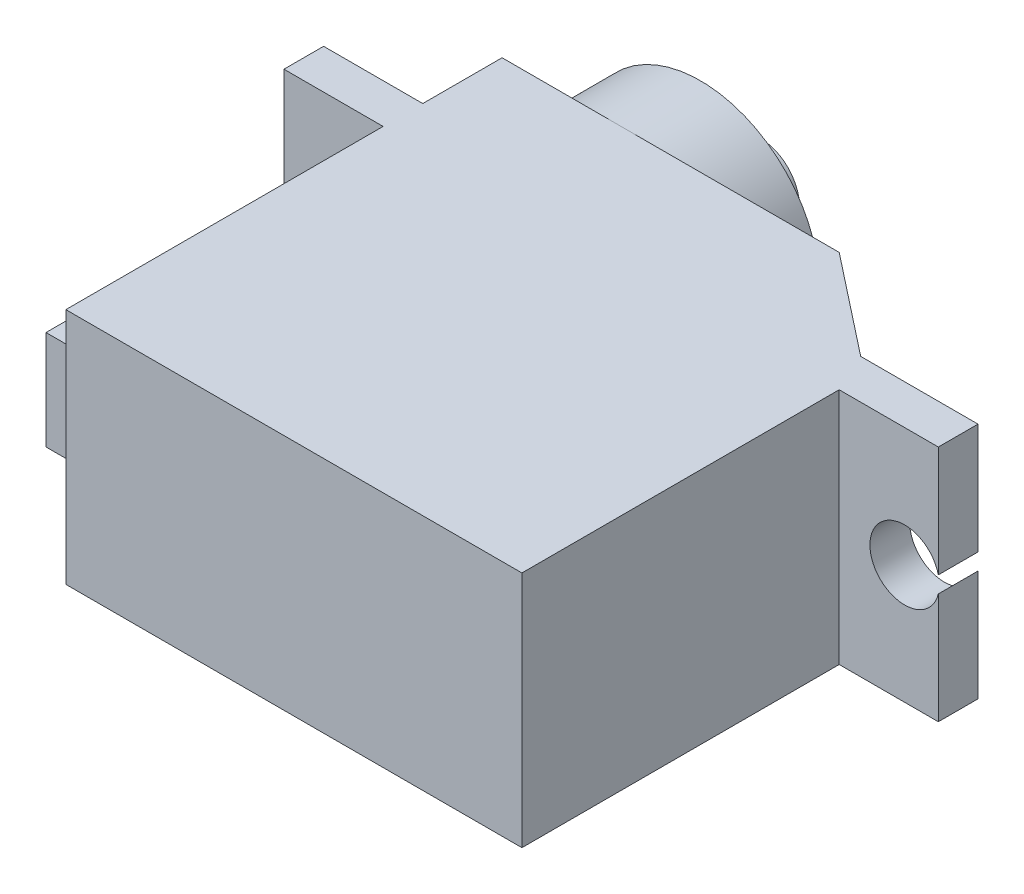
ISO-10303-21;
HEADER;
FILE_DESCRIPTION(('STEP AP214'),'2;1');
FILE_NAME('part.step','',(''),(''),'','','');
FILE_SCHEMA(('AUTOMOTIVE_DESIGN { 1 0 10303 214 1 1 1 1 }'));
ENDSEC;
DATA;
#1=APPLICATION_CONTEXT('core data for automotive mechanical design processes');
#2=APPLICATION_PROTOCOL_DEFINITION('international standard','automotive_design',2000,#1);
#3=PRODUCT_CONTEXT('',#1,'mechanical');
#4=PRODUCT('Part','Part','',(#3));
#5=PRODUCT_RELATED_PRODUCT_CATEGORY('part','',(#4));
#6=PRODUCT_DEFINITION_FORMATION('','',#4);
#7=PRODUCT_DEFINITION_CONTEXT('part definition',#1,'design');
#8=PRODUCT_DEFINITION('design','',#6,#7);
#9=PRODUCT_DEFINITION_SHAPE('','',#8);
#10=(LENGTH_UNIT() NAMED_UNIT(*) SI_UNIT(.MILLI.,.METRE.));
#11=(NAMED_UNIT(*) PLANE_ANGLE_UNIT() SI_UNIT($,.RADIAN.));
#12=(NAMED_UNIT(*) SI_UNIT($,.STERADIAN.) SOLID_ANGLE_UNIT());
#13=UNCERTAINTY_MEASURE_WITH_UNIT(LENGTH_MEASURE(1.E-05),#10,'distance_accuracy_value','');
#14=(GEOMETRIC_REPRESENTATION_CONTEXT(3) GLOBAL_UNCERTAINTY_ASSIGNED_CONTEXT((#13)) GLOBAL_UNIT_ASSIGNED_CONTEXT((#10,
#11,#12)) REPRESENTATION_CONTEXT('',''));
#15=CARTESIAN_POINT('',(0.,0.,0.));
#16=DIRECTION('',(0.,0.,1.));
#17=DIRECTION('',(1.,0.,0.));
#18=AXIS2_PLACEMENT_3D('',#15,#16,#17);
#19=CARTESIAN_POINT('',(0.,12.,0.));
#20=DIRECTION('',(1.,0.,0.));
#21=DIRECTION('',(0.,0.,-1.));
#22=AXIS2_PLACEMENT_3D('',#19,#20,#21);
#23=PLANE('',#22);
#24=DIRECTION('',(0.,0.,1.));
#25=VECTOR('',#24,1.);
#26=CARTESIAN_POINT('',(0.,12.,0.));
#27=LINE('',#26,#25);
#28=CARTESIAN_POINT('',(0.,12.,-16.));
#29=VERTEX_POINT('',#28);
#30=CARTESIAN_POINT('',(0.,12.,0.));
#31=VERTEX_POINT('',#30);
#32=EDGE_CURVE('E285',#29,#31,#27,.T.);
#33=ORIENTED_EDGE('',*,*,#32,.F.);
#34=DIRECTION('',(0.,-1.,0.));
#35=VECTOR('',#34,1.);
#36=CARTESIAN_POINT('',(0.,12.,-16.));
#37=LINE('',#36,#35);
#38=CARTESIAN_POINT('',(0.,0.,-16.));
#39=VERTEX_POINT('',#38);
#40=EDGE_CURVE('E272',#29,#39,#37,.T.);
#41=ORIENTED_EDGE('',*,*,#40,.T.);
#42=DIRECTION('',(0.,0.,1.));
#43=VECTOR('',#42,1.);
#44=CARTESIAN_POINT('',(0.,0.,0.));
#45=LINE('',#44,#43);
#46=CARTESIAN_POINT('',(0.,0.,0.));
#47=VERTEX_POINT('',#46);
#48=EDGE_CURVE('E280',#39,#47,#45,.T.);
#49=ORIENTED_EDGE('',*,*,#48,.T.);
#50=DIRECTION('',(0.,-1.,0.));
#51=VECTOR('',#50,1.);
#52=CARTESIAN_POINT('',(0.,12.,0.));
#53=LINE('',#52,#51);
#54=EDGE_CURVE('E317',#31,#47,#53,.T.);
#55=ORIENTED_EDGE('',*,*,#54,.F.);
#56=EDGE_LOOP('',(#33,#41,#49,#55));
#57=FACE_BOUND('',#56,.T.);
#58=DIRECTION('',(0.,1.,0.));
#59=VECTOR('',#58,1.);
#60=CARTESIAN_POINT('',(0.,3.5,-2.));
#61=LINE('',#60,#59);
#62=CARTESIAN_POINT('',(0.,3.5,-2.));
#63=VERTEX_POINT('',#62);
#64=CARTESIAN_POINT('',(0.,8.5,-2.));
#65=VERTEX_POINT('',#64);
#66=EDGE_CURVE('E200',#63,#65,#61,.T.);
#67=ORIENTED_EDGE('',*,*,#66,.F.);
#68=DIRECTION('',(0.,0.,1.));
#69=VECTOR('',#68,1.);
#70=CARTESIAN_POINT('',(0.,3.5,-2.));
#71=LINE('',#70,#69);
#72=CARTESIAN_POINT('',(0.,3.5,-4.));
#73=VERTEX_POINT('',#72);
#74=EDGE_CURVE('E197',#73,#63,#71,.T.);
#75=ORIENTED_EDGE('',*,*,#74,.F.);
#76=DIRECTION('',(0.,-1.,0.));
#77=VECTOR('',#76,1.);
#78=CARTESIAN_POINT('',(0.,3.5,-4.));
#79=LINE('',#78,#77);
#80=CARTESIAN_POINT('',(0.,8.5,-4.));
#81=VERTEX_POINT('',#80);
#82=EDGE_CURVE('E54',#81,#73,#79,.T.);
#83=ORIENTED_EDGE('',*,*,#82,.F.);
#84=DIRECTION('',(0.,0.,-1.));
#85=VECTOR('',#84,1.);
#86=CARTESIAN_POINT('',(0.,8.5,-2.));
#87=LINE('',#86,#85);
#88=EDGE_CURVE('E49',#65,#81,#87,.T.);
#89=ORIENTED_EDGE('',*,*,#88,.F.);
#90=EDGE_LOOP('',(#67,#75,#83,#89));
#91=FACE_BOUND('',#90,.T.);
#92=ADVANCED_FACE('F32',(#57,#91),#23,.F.);
#93=CARTESIAN_POINT('',(6.,6.,-26.));
#94=DIRECTION('',(0.,0.,-1.));
#95=DIRECTION('',(-1.,0.,0.));
#96=AXIS2_PLACEMENT_3D('',#93,#94,#95);
#97=PLANE('',#96);
#98=CARTESIAN_POINT('',(6.,6.,-26.));
#99=DIRECTION('',(0.,0.,-1.));
#100=DIRECTION('',(-1.,0.,0.));
#101=AXIS2_PLACEMENT_3D('',#98,#99,#100);
#102=CIRCLE('',#101,6.);
#103=CARTESIAN_POINT('',(0.,6.,-26.));
#104=VERTEX_POINT('',#103);
#105=EDGE_CURVE('E212',#104,#104,#102,.T.);
#106=ORIENTED_EDGE('',*,*,#105,.T.);
#107=EDGE_LOOP('',(#106));
#108=FACE_BOUND('',#107,.T.);
#109=CARTESIAN_POINT('',(6.,6.,-26.));
#110=DIRECTION('',(0.,0.,-1.));
#111=DIRECTION('',(-1.,0.,0.));
#112=AXIS2_PLACEMENT_3D('',#109,#110,#111);
#113=CIRCLE('',#112,2.);
#114=CARTESIAN_POINT('',(4.,6.,-26.));
#115=VERTEX_POINT('',#114);
#116=EDGE_CURVE('E201',#115,#115,#113,.T.);
#117=ORIENTED_EDGE('',*,*,#116,.F.);
#118=EDGE_LOOP('',(#117));
#119=FACE_BOUND('',#118,.T.);
#120=ADVANCED_FACE('F404',(#108,#119),#97,.T.);
#121=CARTESIAN_POINT('',(0.,12.,-22.));
#122=DIRECTION('',(0.,0.,1.));
#123=DIRECTION('',(1.,0.,0.));
#124=AXIS2_PLACEMENT_3D('',#121,#122,#123);
#125=PLANE('',#124);
#126=CARTESIAN_POINT('',(6.,6.,-22.));
#127=DIRECTION('',(0.,0.,-1.));
#128=DIRECTION('',(-1.,0.,0.));
#129=AXIS2_PLACEMENT_3D('',#126,#127,#128);
#130=CIRCLE('',#129,6.);
#131=CARTESIAN_POINT('',(0.,6.,-22.));
#132=VERTEX_POINT('',#131);
#133=CARTESIAN_POINT('',(6.,12.,-22.));
#134=VERTEX_POINT('',#133);
#135=EDGE_CURVE('E42',#132,#134,#130,.T.);
#136=ORIENTED_EDGE('',*,*,#135,.F.);
#137=DIRECTION('',(0.,-1.,0.));
#138=VECTOR('',#137,1.);
#139=CARTESIAN_POINT('',(0.,12.,-22.));
#140=LINE('',#139,#138);
#141=CARTESIAN_POINT('',(0.,12.,-22.));
#142=VERTEX_POINT('',#141);
#143=EDGE_CURVE('E309',#142,#132,#140,.T.);
#144=ORIENTED_EDGE('',*,*,#143,.F.);
#145=DIRECTION('',(-1.,0.,0.));
#146=VECTOR('',#145,1.);
#147=CARTESIAN_POINT('',(0.,12.,-22.));
#148=LINE('',#147,#146);
#149=EDGE_CURVE('E292',#134,#142,#148,.T.);
#150=ORIENTED_EDGE('',*,*,#149,.F.);
#151=EDGE_LOOP('',(#136,#144,#150));
#152=FACE_BOUND('',#151,.T.);
#153=ADVANCED_FACE('F402',(#152),#125,.F.);
#154=CARTESIAN_POINT('',(6.,0.,-22.));
#155=VERTEX_POINT('',#154);
#156=EDGE_CURVE('E11',#134,#155,#130,.T.);
#157=ORIENTED_EDGE('',*,*,#156,.F.);
#158=CARTESIAN_POINT('',(17.,12.,-22.));
#159=VERTEX_POINT('',#158);
#160=EDGE_CURVE('E293',#159,#134,#148,.T.);
#161=ORIENTED_EDGE('',*,*,#160,.F.);
#162=DIRECTION('',(0.,-1.,0.));
#163=VECTOR('',#162,1.);
#164=CARTESIAN_POINT('',(17.,12.,-22.));
#165=LINE('',#164,#163);
#166=CARTESIAN_POINT('',(17.,0.,-22.));
#167=VERTEX_POINT('',#166);
#168=EDGE_CURVE('E311',#159,#167,#165,.T.);
#169=ORIENTED_EDGE('',*,*,#168,.T.);
#170=DIRECTION('',(-1.,0.,0.));
#171=VECTOR('',#170,1.);
#172=CARTESIAN_POINT('',(0.,0.,-22.));
#173=LINE('',#172,#171);
#174=EDGE_CURVE('E306',#167,#155,#173,.T.);
#175=ORIENTED_EDGE('',*,*,#174,.T.);
#176=EDGE_LOOP('',(#157,#161,#169,#175));
#177=FACE_BOUND('',#176,.T.);
#178=ADVANCED_FACE('F344',(#177),#125,.F.);
#179=EDGE_CURVE('E40',#155,#132,#130,.T.);
#180=ORIENTED_EDGE('',*,*,#179,.F.);
#181=CARTESIAN_POINT('',(0.,0.,-22.));
#182=VERTEX_POINT('',#181);
#183=EDGE_CURVE('E305',#155,#182,#173,.T.);
#184=ORIENTED_EDGE('',*,*,#183,.T.);
#185=EDGE_CURVE('E296',#132,#182,#140,.T.);
#186=ORIENTED_EDGE('',*,*,#185,.F.);
#187=EDGE_LOOP('',(#180,#184,#186));
#188=FACE_BOUND('',#187,.T.);
#189=ADVANCED_FACE('F337',(#188),#125,.F.);
#190=CARTESIAN_POINT('',(28.,0.,0.));
#191=DIRECTION('',(1.,0.,0.));
#192=DIRECTION('',(0.,0.,-1.));
#193=AXIS2_PLACEMENT_3D('',#190,#191,#192);
#194=PLANE('',#193);
#195=DIRECTION('',(0.,0.,-1.));
#196=VECTOR('',#195,1.);
#197=CARTESIAN_POINT('',(28.,5.5846688068541,-13.));
#198=LINE('',#197,#196);
#199=CARTESIAN_POINT('',(28.,5.5846688068541,-16.));
#200=VERTEX_POINT('',#199);
#201=CARTESIAN_POINT('',(28.,5.5846688068541,-18.));
#202=VERTEX_POINT('',#201);
#203=EDGE_CURVE('E220',#200,#202,#198,.T.);
#204=ORIENTED_EDGE('',*,*,#203,.F.);
#205=DIRECTION('',(0.,1.,0.));
#206=VECTOR('',#205,1.);
#207=CARTESIAN_POINT('',(28.,0.,-16.));
#208=LINE('',#207,#206);
#209=CARTESIAN_POINT('',(28.,0.,-16.));
#210=VERTEX_POINT('',#209);
#211=EDGE_CURVE('E248',#210,#200,#208,.T.);
#212=ORIENTED_EDGE('',*,*,#211,.F.);
#213=DIRECTION('',(0.,0.,1.));
#214=VECTOR('',#213,1.);
#215=CARTESIAN_POINT('',(28.,0.,-18.));
#216=LINE('',#215,#214);
#217=CARTESIAN_POINT('',(28.,0.,-18.));
#218=VERTEX_POINT('',#217);
#219=EDGE_CURVE('E244',#218,#210,#216,.T.);
#220=ORIENTED_EDGE('',*,*,#219,.F.);
#221=DIRECTION('',(0.,-1.,0.));
#222=VECTOR('',#221,1.);
#223=CARTESIAN_POINT('',(28.,0.,-18.));
#224=LINE('',#223,#222);
#225=EDGE_CURVE('E240',#202,#218,#224,.T.);
#226=ORIENTED_EDGE('',*,*,#225,.F.);
#227=EDGE_LOOP('',(#204,#212,#220,#226));
#228=FACE_BOUND('',#227,.T.);
#229=ADVANCED_FACE('F357',(#228),#194,.T.);
#230=CARTESIAN_POINT('',(-5.,0.,0.));
#231=DIRECTION('',(1.,0.,0.));
#232=DIRECTION('',(0.,0.,-1.));
#233=AXIS2_PLACEMENT_3D('',#230,#231,#232);
#234=PLANE('',#233);
#235=DIRECTION('',(0.,1.,0.));
#236=VECTOR('',#235,1.);
#237=CARTESIAN_POINT('',(-5.,0.,-16.));
#238=LINE('',#237,#236);
#239=CARTESIAN_POINT('',(-5.,0.,-16.));
#240=VERTEX_POINT('',#239);
#241=CARTESIAN_POINT('',(-5.,5.5846688068541,-16.));
#242=VERTEX_POINT('',#241);
#243=EDGE_CURVE('E234',#240,#242,#238,.T.);
#244=ORIENTED_EDGE('',*,*,#243,.T.);
#245=DIRECTION('',(0.,0.,-1.));
#246=VECTOR('',#245,1.);
#247=CARTESIAN_POINT('',(-5.,5.5846688068541,-13.));
#248=LINE('',#247,#246);
#249=CARTESIAN_POINT('',(-5.,5.5846688068541,-18.));
#250=VERTEX_POINT('',#249);
#251=EDGE_CURVE('E322',#242,#250,#248,.T.);
#252=ORIENTED_EDGE('',*,*,#251,.T.);
#253=DIRECTION('',(0.,-1.,0.));
#254=VECTOR('',#253,1.);
#255=CARTESIAN_POINT('',(-5.,0.,-18.));
#256=LINE('',#255,#254);
#257=CARTESIAN_POINT('',(-5.,0.,-18.));
#258=VERTEX_POINT('',#257);
#259=EDGE_CURVE('E226',#250,#258,#256,.T.);
#260=ORIENTED_EDGE('',*,*,#259,.T.);
#261=DIRECTION('',(0.,0.,1.));
#262=VECTOR('',#261,1.);
#263=CARTESIAN_POINT('',(-5.,0.,-18.));
#264=LINE('',#263,#262);
#265=EDGE_CURVE('E230',#258,#240,#264,.T.);
#266=ORIENTED_EDGE('',*,*,#265,.T.);
#267=EDGE_LOOP('',(#244,#252,#260,#266));
#268=FACE_BOUND('',#267,.T.);
#269=ADVANCED_FACE('F378',(#268),#234,.F.);
#270=CARTESIAN_POINT('',(0.,0.,-18.));
#271=VERTEX_POINT('',#270);
#272=EDGE_CURVE('E297',#182,#271,#45,.T.);
#273=ORIENTED_EDGE('',*,*,#272,.T.);
#274=DIRECTION('',(0.,1.,0.));
#275=VECTOR('',#274,1.);
#276=CARTESIAN_POINT('',(0.,12.,-18.));
#277=LINE('',#276,#275);
#278=CARTESIAN_POINT('',(0.,12.,-18.));
#279=VERTEX_POINT('',#278);
#280=EDGE_CURVE('E278',#271,#279,#277,.T.);
#281=ORIENTED_EDGE('',*,*,#280,.T.);
#282=EDGE_CURVE('E281',#142,#279,#27,.T.);
#283=ORIENTED_EDGE('',*,*,#282,.F.);
#284=ORIENTED_EDGE('',*,*,#143,.T.);
#285=ORIENTED_EDGE('',*,*,#185,.T.);
#286=EDGE_LOOP('',(#273,#281,#283,#284,#285));
#287=FACE_BOUND('',#286,.T.);
#288=ADVANCED_FACE('F397',(#287),#23,.F.);
#289=CARTESIAN_POINT('',(0.,12.,0.));
#290=DIRECTION('',(0.,0.,-1.));
#291=DIRECTION('',(-1.,0.,0.));
#292=AXIS2_PLACEMENT_3D('',#289,#290,#291);
#293=PLANE('',#292);
#294=DIRECTION('',(1.,0.,0.));
#295=VECTOR('',#294,1.);
#296=CARTESIAN_POINT('',(0.,0.,0.));
#297=LINE('',#296,#295);
#298=CARTESIAN_POINT('',(23.,0.,0.));
#299=VERTEX_POINT('',#298);
#300=EDGE_CURVE('E299',#47,#299,#297,.T.);
#301=ORIENTED_EDGE('',*,*,#300,.T.);
#302=DIRECTION('',(0.,-1.,0.));
#303=VECTOR('',#302,1.);
#304=CARTESIAN_POINT('',(23.,12.,0.));
#305=LINE('',#304,#303);
#306=CARTESIAN_POINT('',(23.,12.,0.));
#307=VERTEX_POINT('',#306);
#308=EDGE_CURVE('E314',#307,#299,#305,.T.);
#309=ORIENTED_EDGE('',*,*,#308,.F.);
#310=DIRECTION('',(1.,0.,0.));
#311=VECTOR('',#310,1.);
#312=CARTESIAN_POINT('',(0.,12.,0.));
#313=LINE('',#312,#311);
#314=EDGE_CURVE('E284',#31,#307,#313,.T.);
#315=ORIENTED_EDGE('',*,*,#314,.F.);
#316=ORIENTED_EDGE('',*,*,#54,.T.);
#317=EDGE_LOOP('',(#301,#309,#315,#316));
#318=FACE_BOUND('',#317,.T.);
#319=ADVANCED_FACE('F370',(#318),#293,.F.);
#320=CARTESIAN_POINT('',(23.,12.,0.));
#321=DIRECTION('',(-1.,0.,0.));
#322=DIRECTION('',(0.,0.,1.));
#323=AXIS2_PLACEMENT_3D('',#320,#321,#322);
#324=PLANE('',#323);
#325=DIRECTION('',(0.,0.,-1.));
#326=VECTOR('',#325,1.);
#327=CARTESIAN_POINT('',(23.,0.,0.));
#328=LINE('',#327,#326);
#329=CARTESIAN_POINT('',(23.,0.,-16.));
#330=VERTEX_POINT('',#329);
#331=EDGE_CURVE('E301',#299,#330,#328,.T.);
#332=ORIENTED_EDGE('',*,*,#331,.T.);
#333=DIRECTION('',(0.,1.,0.));
#334=VECTOR('',#333,1.);
#335=CARTESIAN_POINT('',(23.,12.,-16.));
#336=LINE('',#335,#334);
#337=CARTESIAN_POINT('',(23.,12.,-16.));
#338=VERTEX_POINT('',#337);
#339=EDGE_CURVE('E258',#330,#338,#336,.T.);
#340=ORIENTED_EDGE('',*,*,#339,.T.);
#341=DIRECTION('',(0.,0.,-1.));
#342=VECTOR('',#341,1.);
#343=CARTESIAN_POINT('',(23.,12.,0.));
#344=LINE('',#343,#342);
#345=EDGE_CURVE('E287',#307,#338,#344,.T.);
#346=ORIENTED_EDGE('',*,*,#345,.F.);
#347=ORIENTED_EDGE('',*,*,#308,.T.);
#348=EDGE_LOOP('',(#332,#340,#346,#347));
#349=FACE_BOUND('',#348,.T.);
#350=ADVANCED_FACE('F365',(#349),#324,.F.);
#351=CARTESIAN_POINT('',(17.,12.,-22.));
#352=DIRECTION('',(-0.618310453402129,0.,0.785933956012624));
#353=DIRECTION('',(0.785933956012624,0.,0.618310453402129));
#354=AXIS2_PLACEMENT_3D('',#351,#352,#353);
#355=PLANE('',#354);
#356=DIRECTION('',(-0.785933956012624,0.,-0.618310453402129));
#357=VECTOR('',#356,1.);
#358=CARTESIAN_POINT('',(17.,12.,-22.));
#359=LINE('',#358,#357);
#360=CARTESIAN_POINT('',(22.0843970156945,12.,-18.));
#361=VERTEX_POINT('',#360);
#362=EDGE_CURVE('E290',#361,#159,#359,.T.);
#363=ORIENTED_EDGE('',*,*,#362,.F.);
#364=DIRECTION('',(0.,-1.,0.));
#365=VECTOR('',#364,1.);
#366=CARTESIAN_POINT('',(22.0843970156945,12.,-18.));
#367=LINE('',#366,#365);
#368=CARTESIAN_POINT('',(22.0843970156945,0.,-18.));
#369=VERTEX_POINT('',#368);
#370=EDGE_CURVE('E275',#361,#369,#367,.T.);
#371=ORIENTED_EDGE('',*,*,#370,.T.);
#372=DIRECTION('',(-0.785933956012624,0.,-0.618310453402129));
#373=VECTOR('',#372,1.);
#374=CARTESIAN_POINT('',(17.,0.,-22.));
#375=LINE('',#374,#373);
#376=EDGE_CURVE('E303',#369,#167,#375,.T.);
#377=ORIENTED_EDGE('',*,*,#376,.T.);
#378=ORIENTED_EDGE('',*,*,#168,.F.);
#379=EDGE_LOOP('',(#363,#371,#377,#378));
#380=FACE_BOUND('',#379,.T.);
#381=ADVANCED_FACE('F349',(#380),#355,.F.);
#382=CARTESIAN_POINT('',(0.,12.,0.));
#383=DIRECTION('',(0.,-1.,0.));
#384=DIRECTION('',(0.,0.,-1.));
#385=AXIS2_PLACEMENT_3D('',#382,#383,#384);
#386=PLANE('',#385);
#387=ORIENTED_EDGE('',*,*,#345,.T.);
#388=DIRECTION('',(-1.,0.,0.));
#389=VECTOR('',#388,1.);
#390=CARTESIAN_POINT('',(28.,12.,-16.));
#391=LINE('',#390,#389);
#392=CARTESIAN_POINT('',(28.,12.,-16.));
#393=VERTEX_POINT('',#392);
#394=EDGE_CURVE('E260',#393,#338,#391,.T.);
#395=ORIENTED_EDGE('',*,*,#394,.F.);
#396=DIRECTION('',(0.,0.,-1.));
#397=VECTOR('',#396,1.);
#398=CARTESIAN_POINT('',(28.,12.,-18.));
#399=LINE('',#398,#397);
#400=CARTESIAN_POINT('',(28.,12.,-18.));
#401=VERTEX_POINT('',#400);
#402=EDGE_CURVE('E251',#393,#401,#399,.T.);
#403=ORIENTED_EDGE('',*,*,#402,.T.);
#404=DIRECTION('',(-1.,0.,0.));
#405=VECTOR('',#404,1.);
#406=CARTESIAN_POINT('',(28.,12.,-18.));
#407=LINE('',#406,#405);
#408=EDGE_CURVE('E255',#401,#361,#407,.T.);
#409=ORIENTED_EDGE('',*,*,#408,.T.);
#410=ORIENTED_EDGE('',*,*,#362,.T.);
#411=ORIENTED_EDGE('',*,*,#160,.T.);
#412=ORIENTED_EDGE('',*,*,#149,.T.);
#413=ORIENTED_EDGE('',*,*,#282,.T.);
#414=CARTESIAN_POINT('',(-5.,12.,-18.));
#415=VERTEX_POINT('',#414);
#416=EDGE_CURVE('E259',#279,#415,#407,.T.);
#417=ORIENTED_EDGE('',*,*,#416,.T.);
#418=DIRECTION('',(0.,0.,-1.));
#419=VECTOR('',#418,1.);
#420=CARTESIAN_POINT('',(-5.,12.,-18.));
#421=LINE('',#420,#419);
#422=CARTESIAN_POINT('',(-5.,12.,-16.));
#423=VERTEX_POINT('',#422);
#424=EDGE_CURVE('E237',#423,#415,#421,.T.);
#425=ORIENTED_EDGE('',*,*,#424,.F.);
#426=EDGE_CURVE('E263',#29,#423,#391,.T.);
#427=ORIENTED_EDGE('',*,*,#426,.F.);
#428=ORIENTED_EDGE('',*,*,#32,.T.);
#429=ORIENTED_EDGE('',*,*,#314,.T.);
#430=EDGE_LOOP('',(#387,#395,#403,#409,#410,#411,#412,#413,#417,#425,#427,#428,#429));
#431=FACE_BOUND('',#430,.T.);
#432=ADVANCED_FACE('F399',(#431),#386,.F.);
#433=CARTESIAN_POINT('',(0.,0.,0.));
#434=DIRECTION('',(0.,-1.,0.));
#435=DIRECTION('',(0.,0.,-1.));
#436=AXIS2_PLACEMENT_3D('',#433,#434,#435);
#437=PLANE('',#436);
#438=ORIENTED_EDGE('',*,*,#48,.F.);
#439=DIRECTION('',(-1.,0.,0.));
#440=VECTOR('',#439,1.);
#441=CARTESIAN_POINT('',(28.,0.,-16.));
#442=LINE('',#441,#440);
#443=EDGE_CURVE('E267',#39,#240,#442,.T.);
#444=ORIENTED_EDGE('',*,*,#443,.T.);
#445=ORIENTED_EDGE('',*,*,#265,.F.);
#446=DIRECTION('',(-1.,0.,0.));
#447=VECTOR('',#446,1.);
#448=CARTESIAN_POINT('',(28.,0.,-18.));
#449=LINE('',#448,#447);
#450=EDGE_CURVE('E254',#271,#258,#449,.T.);
#451=ORIENTED_EDGE('',*,*,#450,.F.);
#452=ORIENTED_EDGE('',*,*,#272,.F.);
#453=ORIENTED_EDGE('',*,*,#183,.F.);
#454=ORIENTED_EDGE('',*,*,#174,.F.);
#455=ORIENTED_EDGE('',*,*,#376,.F.);
#456=EDGE_CURVE('E268',#218,#369,#449,.T.);
#457=ORIENTED_EDGE('',*,*,#456,.F.);
#458=ORIENTED_EDGE('',*,*,#219,.T.);
#459=EDGE_CURVE('E264',#210,#330,#442,.T.);
#460=ORIENTED_EDGE('',*,*,#459,.T.);
#461=ORIENTED_EDGE('',*,*,#331,.F.);
#462=ORIENTED_EDGE('',*,*,#300,.F.);
#463=EDGE_LOOP('',(#438,#444,#445,#451,#452,#453,#454,#455,#457,#458,#460,#461,#462));
#464=FACE_BOUND('',#463,.T.);
#465=ADVANCED_FACE('F341',(#464),#437,.T.);
#466=DIRECTION('',(0.,0.,-1.));
#467=VECTOR('',#466,1.);
#468=CARTESIAN_POINT('',(28.,6.4153311931459,-13.));
#469=LINE('',#468,#467);
#470=CARTESIAN_POINT('',(28.,6.4153311931459,-18.));
#471=VERTEX_POINT('',#470);
#472=CARTESIAN_POINT('',(28.,6.4153311931459,-16.));
#473=VERTEX_POINT('',#472);
#474=EDGE_CURVE('E218',#471,#473,#469,.F.);
#475=ORIENTED_EDGE('',*,*,#474,.F.);
#476=EDGE_CURVE('E241',#401,#471,#224,.T.);
#477=ORIENTED_EDGE('',*,*,#476,.F.);
#478=ORIENTED_EDGE('',*,*,#402,.F.);
#479=EDGE_CURVE('E247',#473,#393,#208,.T.);
#480=ORIENTED_EDGE('',*,*,#479,.F.);
#481=EDGE_LOOP('',(#475,#477,#478,#480));
#482=FACE_BOUND('',#481,.T.);
#483=ADVANCED_FACE('F428',(#482),#194,.T.);
#484=CARTESIAN_POINT('',(28.,0.,-18.));
#485=DIRECTION('',(0.,0.,-1.));
#486=DIRECTION('',(-1.,0.,0.));
#487=AXIS2_PLACEMENT_3D('',#484,#485,#486);
#488=PLANE('',#487);
#489=CARTESIAN_POINT('',(26.3,6.,-18.));
#490=DIRECTION('',(0.,0.,-1.));
#491=DIRECTION('',(-1.,0.,0.));
#492=AXIS2_PLACEMENT_3D('',#489,#490,#491);
#493=CIRCLE('',#492,1.75);
#494=EDGE_CURVE('E214',#202,#471,#493,.T.);
#495=ORIENTED_EDGE('',*,*,#494,.F.);
#496=ORIENTED_EDGE('',*,*,#225,.T.);
#497=ORIENTED_EDGE('',*,*,#456,.T.);
#498=ORIENTED_EDGE('',*,*,#370,.F.);
#499=ORIENTED_EDGE('',*,*,#408,.F.);
#500=ORIENTED_EDGE('',*,*,#476,.T.);
#501=EDGE_LOOP('',(#495,#496,#497,#498,#499,#500));
#502=FACE_BOUND('',#501,.T.);
#503=ADVANCED_FACE('F441',(#502),#488,.T.);
#504=CARTESIAN_POINT('',(28.,0.,-16.));
#505=DIRECTION('',(0.,0.,1.));
#506=DIRECTION('',(1.,0.,0.));
#507=AXIS2_PLACEMENT_3D('',#504,#505,#506);
#508=PLANE('',#507);
#509=CARTESIAN_POINT('',(26.3,6.,-16.));
#510=DIRECTION('',(0.,0.,1.));
#511=DIRECTION('',(1.,0.,0.));
#512=AXIS2_PLACEMENT_3D('',#509,#510,#511);
#513=CIRCLE('',#512,1.75);
#514=EDGE_CURVE('E35',#473,#200,#513,.T.);
#515=ORIENTED_EDGE('',*,*,#514,.F.);
#516=ORIENTED_EDGE('',*,*,#479,.T.);
#517=ORIENTED_EDGE('',*,*,#394,.T.);
#518=ORIENTED_EDGE('',*,*,#339,.F.);
#519=ORIENTED_EDGE('',*,*,#459,.F.);
#520=ORIENTED_EDGE('',*,*,#211,.T.);
#521=EDGE_LOOP('',(#515,#516,#517,#518,#519,#520));
#522=FACE_BOUND('',#521,.T.);
#523=ADVANCED_FACE('F359',(#522),#508,.T.);
#524=CARTESIAN_POINT('',(-3.3,6.,-18.));
#525=DIRECTION('',(0.,0.,-1.));
#526=DIRECTION('',(-1.,0.,0.));
#527=AXIS2_PLACEMENT_3D('',#524,#525,#526);
#528=CIRCLE('',#527,1.75);
#529=CARTESIAN_POINT('',(-5.,6.4153311931459,-18.));
#530=VERTEX_POINT('',#529);
#531=EDGE_CURVE('E222',#530,#250,#528,.T.);
#532=ORIENTED_EDGE('',*,*,#531,.F.);
#533=EDGE_CURVE('E227',#415,#530,#256,.T.);
#534=ORIENTED_EDGE('',*,*,#533,.F.);
#535=ORIENTED_EDGE('',*,*,#416,.F.);
#536=ORIENTED_EDGE('',*,*,#280,.F.);
#537=ORIENTED_EDGE('',*,*,#450,.T.);
#538=ORIENTED_EDGE('',*,*,#259,.F.);
#539=EDGE_LOOP('',(#532,#534,#535,#536,#537,#538));
#540=FACE_BOUND('',#539,.T.);
#541=ADVANCED_FACE('F393',(#540),#488,.T.);
#542=CARTESIAN_POINT('',(-3.3,6.,-16.));
#543=DIRECTION('',(0.,0.,1.));
#544=DIRECTION('',(1.,0.,0.));
#545=AXIS2_PLACEMENT_3D('',#542,#543,#544);
#546=CIRCLE('',#545,1.75);
#547=CARTESIAN_POINT('',(-5.,6.4153311931459,-16.));
#548=VERTEX_POINT('',#547);
#549=EDGE_CURVE('E224',#242,#548,#546,.T.);
#550=ORIENTED_EDGE('',*,*,#549,.F.);
#551=ORIENTED_EDGE('',*,*,#243,.F.);
#552=ORIENTED_EDGE('',*,*,#443,.F.);
#553=ORIENTED_EDGE('',*,*,#40,.F.);
#554=ORIENTED_EDGE('',*,*,#426,.T.);
#555=EDGE_CURVE('E233',#548,#423,#238,.T.);
#556=ORIENTED_EDGE('',*,*,#555,.F.);
#557=EDGE_LOOP('',(#550,#551,#552,#553,#554,#556));
#558=FACE_BOUND('',#557,.T.);
#559=ADVANCED_FACE('F381',(#558),#508,.T.);
#560=ORIENTED_EDGE('',*,*,#533,.T.);
#561=DIRECTION('',(0.,0.,-1.));
#562=VECTOR('',#561,1.);
#563=CARTESIAN_POINT('',(-5.,6.4153311931459,-13.));
#564=LINE('',#563,#562);
#565=EDGE_CURVE('E320',#530,#548,#564,.F.);
#566=ORIENTED_EDGE('',*,*,#565,.T.);
#567=ORIENTED_EDGE('',*,*,#555,.T.);
#568=ORIENTED_EDGE('',*,*,#424,.T.);
#569=EDGE_LOOP('',(#560,#566,#567,#568));
#570=FACE_BOUND('',#569,.T.);
#571=ADVANCED_FACE('F388',(#570),#234,.F.);
#572=CARTESIAN_POINT('',(-3.3,6.,-13.));
#573=DIRECTION('',(0.,0.,-1.));
#574=DIRECTION('',(-1.,0.,0.));
#575=AXIS2_PLACEMENT_3D('',#572,#573,#574);
#576=CYLINDRICAL_SURFACE('',#575,1.75);
#577=ORIENTED_EDGE('',*,*,#549,.T.);
#578=ORIENTED_EDGE('',*,*,#565,.F.);
#579=ORIENTED_EDGE('',*,*,#531,.T.);
#580=ORIENTED_EDGE('',*,*,#251,.F.);
#581=EDGE_LOOP('',(#577,#578,#579,#580));
#582=FACE_BOUND('',#581,.T.);
#583=ADVANCED_FACE('F385',(#582),#576,.F.);
#584=CARTESIAN_POINT('',(26.3,6.,-13.));
#585=DIRECTION('',(0.,0.,-1.));
#586=DIRECTION('',(-1.,0.,0.));
#587=AXIS2_PLACEMENT_3D('',#584,#585,#586);
#588=CYLINDRICAL_SURFACE('',#587,1.75);
#589=ORIENTED_EDGE('',*,*,#203,.T.);
#590=ORIENTED_EDGE('',*,*,#494,.T.);
#591=ORIENTED_EDGE('',*,*,#474,.T.);
#592=ORIENTED_EDGE('',*,*,#514,.T.);
#593=EDGE_LOOP('',(#589,#590,#591,#592));
#594=FACE_BOUND('',#593,.T.);
#595=ADVANCED_FACE('F435',(#594),#588,.F.);
#596=CARTESIAN_POINT('',(6.,6.,-26.));
#597=DIRECTION('',(0.,0.,1.));
#598=DIRECTION('',(1.,0.,0.));
#599=AXIS2_PLACEMENT_3D('',#596,#597,#598);
#600=CYLINDRICAL_SURFACE('',#599,6.);
#601=ORIENTED_EDGE('',*,*,#105,.F.);
#602=EDGE_LOOP('',(#601));
#603=FACE_BOUND('',#602,.T.);
#604=ORIENTED_EDGE('',*,*,#135,.T.);
#605=ORIENTED_EDGE('',*,*,#156,.T.);
#606=ORIENTED_EDGE('',*,*,#179,.T.);
#607=EDGE_LOOP('',(#604,#605,#606));
#608=FACE_BOUND('',#607,.T.);
#609=ADVANCED_FACE('F331',(#603,#608),#600,.T.);
#610=CARTESIAN_POINT('',(6.,6.,-29.));
#611=DIRECTION('',(0.,0.,1.));
#612=DIRECTION('',(1.,0.,0.));
#613=AXIS2_PLACEMENT_3D('',#610,#611,#612);
#614=CYLINDRICAL_SURFACE('',#613,2.);
#615=CARTESIAN_POINT('',(6.,6.,-29.));
#616=DIRECTION('',(0.,0.,-1.));
#617=DIRECTION('',(-1.,0.,0.));
#618=AXIS2_PLACEMENT_3D('',#615,#616,#617);
#619=CIRCLE('',#618,2.);
#620=CARTESIAN_POINT('',(4.,6.,-29.));
#621=VERTEX_POINT('',#620);
#622=EDGE_CURVE('E204',#621,#621,#619,.T.);
#623=ORIENTED_EDGE('',*,*,#622,.F.);
#624=EDGE_LOOP('',(#623));
#625=FACE_BOUND('',#624,.T.);
#626=ORIENTED_EDGE('',*,*,#116,.T.);
#627=EDGE_LOOP('',(#626));
#628=FACE_BOUND('',#627,.T.);
#629=ADVANCED_FACE('F571',(#625,#628),#614,.T.);
#630=CARTESIAN_POINT('',(6.,6.,-29.));
#631=DIRECTION('',(0.,0.,-1.));
#632=DIRECTION('',(-1.,0.,0.));
#633=AXIS2_PLACEMENT_3D('',#630,#631,#632);
#634=PLANE('',#633);
#635=ORIENTED_EDGE('',*,*,#622,.T.);
#636=EDGE_LOOP('',(#635));
#637=FACE_BOUND('',#636,.T.);
#638=ADVANCED_FACE('F585',(#637),#634,.T.);
#639=CARTESIAN_POINT('',(-3.,3.5,-2.));
#640=DIRECTION('',(0.,0.,-1.));
#641=DIRECTION('',(-1.,0.,0.));
#642=AXIS2_PLACEMENT_3D('',#639,#640,#641);
#643=PLANE('',#642);
#644=ORIENTED_EDGE('',*,*,#66,.T.);
#645=DIRECTION('',(1.,0.,0.));
#646=VECTOR('',#645,1.);
#647=CARTESIAN_POINT('',(-3.,8.5,-2.));
#648=LINE('',#647,#646);
#649=CARTESIAN_POINT('',(-3.,8.5,-2.));
#650=VERTEX_POINT('',#649);
#651=EDGE_CURVE('E181',#650,#65,#648,.T.);
#652=ORIENTED_EDGE('',*,*,#651,.F.);
#653=DIRECTION('',(0.,1.,0.));
#654=VECTOR('',#653,1.);
#655=CARTESIAN_POINT('',(-3.,3.5,-2.));
#656=LINE('',#655,#654);
#657=CARTESIAN_POINT('',(-3.,3.5,-2.));
#658=VERTEX_POINT('',#657);
#659=EDGE_CURVE('E188',#658,#650,#656,.T.);
#660=ORIENTED_EDGE('',*,*,#659,.F.);
#661=DIRECTION('',(1.,0.,0.));
#662=VECTOR('',#661,1.);
#663=CARTESIAN_POINT('',(-3.,3.5,-2.));
#664=LINE('',#663,#662);
#665=EDGE_CURVE('E649',#658,#63,#664,.T.);
#666=ORIENTED_EDGE('',*,*,#665,.T.);
#667=EDGE_LOOP('',(#644,#652,#660,#666));
#668=FACE_BOUND('',#667,.T.);
#669=ADVANCED_FACE('F199',(#668),#643,.F.);
#670=CARTESIAN_POINT('',(-3.,8.5,-2.));
#671=DIRECTION('',(0.,-1.,0.));
#672=DIRECTION('',(0.,0.,-1.));
#673=AXIS2_PLACEMENT_3D('',#670,#671,#672);
#674=PLANE('',#673);
#675=ORIENTED_EDGE('',*,*,#88,.T.);
#676=DIRECTION('',(1.,0.,0.));
#677=VECTOR('',#676,1.);
#678=CARTESIAN_POINT('',(-3.,8.5,-4.));
#679=LINE('',#678,#677);
#680=CARTESIAN_POINT('',(-3.,8.5,-4.));
#681=VERTEX_POINT('',#680);
#682=EDGE_CURVE('E184',#681,#81,#679,.T.);
#683=ORIENTED_EDGE('',*,*,#682,.F.);
#684=DIRECTION('',(0.,0.,-1.));
#685=VECTOR('',#684,1.);
#686=CARTESIAN_POINT('',(-3.,8.5,-2.));
#687=LINE('',#686,#685);
#688=EDGE_CURVE('E177',#650,#681,#687,.T.);
#689=ORIENTED_EDGE('',*,*,#688,.F.);
#690=ORIENTED_EDGE('',*,*,#651,.T.);
#691=EDGE_LOOP('',(#675,#683,#689,#690));
#692=FACE_BOUND('',#691,.T.);
#693=ADVANCED_FACE('F179',(#692),#674,.F.);
#694=CARTESIAN_POINT('',(-3.,3.5,-4.));
#695=DIRECTION('',(0.,0.,1.));
#696=DIRECTION('',(1.,0.,0.));
#697=AXIS2_PLACEMENT_3D('',#694,#695,#696);
#698=PLANE('',#697);
#699=ORIENTED_EDGE('',*,*,#82,.T.);
#700=DIRECTION('',(1.,0.,0.));
#701=VECTOR('',#700,1.);
#702=CARTESIAN_POINT('',(-3.,3.5,-4.));
#703=LINE('',#702,#701);
#704=CARTESIAN_POINT('',(-3.,3.5,-4.));
#705=VERTEX_POINT('',#704);
#706=EDGE_CURVE('E206',#705,#73,#703,.T.);
#707=ORIENTED_EDGE('',*,*,#706,.F.);
#708=DIRECTION('',(0.,-1.,0.));
#709=VECTOR('',#708,1.);
#710=CARTESIAN_POINT('',(-3.,3.5,-4.));
#711=LINE('',#710,#709);
#712=EDGE_CURVE('E187',#681,#705,#711,.T.);
#713=ORIENTED_EDGE('',*,*,#712,.F.);
#714=ORIENTED_EDGE('',*,*,#682,.T.);
#715=EDGE_LOOP('',(#699,#707,#713,#714));
#716=FACE_BOUND('',#715,.T.);
#717=ADVANCED_FACE('F613',(#716),#698,.F.);
#718=CARTESIAN_POINT('',(-3.,3.5,-2.));
#719=DIRECTION('',(0.,1.,0.));
#720=DIRECTION('',(0.,0.,1.));
#721=AXIS2_PLACEMENT_3D('',#718,#719,#720);
#722=PLANE('',#721);
#723=ORIENTED_EDGE('',*,*,#74,.T.);
#724=ORIENTED_EDGE('',*,*,#665,.F.);
#725=DIRECTION('',(0.,0.,1.));
#726=VECTOR('',#725,1.);
#727=CARTESIAN_POINT('',(-3.,3.5,-2.));
#728=LINE('',#727,#726);
#729=EDGE_CURVE('E193',#705,#658,#728,.T.);
#730=ORIENTED_EDGE('',*,*,#729,.F.);
#731=ORIENTED_EDGE('',*,*,#706,.T.);
#732=EDGE_LOOP('',(#723,#724,#730,#731));
#733=FACE_BOUND('',#732,.T.);
#734=ADVANCED_FACE('F621',(#733),#722,.F.);
#735=CARTESIAN_POINT('',(-3.,0.,0.));
#736=DIRECTION('',(-1.,0.,0.));
#737=DIRECTION('',(0.,0.,1.));
#738=AXIS2_PLACEMENT_3D('',#735,#736,#737);
#739=PLANE('',#738);
#740=ORIENTED_EDGE('',*,*,#659,.T.);
#741=ORIENTED_EDGE('',*,*,#688,.T.);
#742=ORIENTED_EDGE('',*,*,#712,.T.);
#743=ORIENTED_EDGE('',*,*,#729,.T.);
#744=EDGE_LOOP('',(#740,#741,#742,#743));
#745=FACE_BOUND('',#744,.T.);
#746=ADVANCED_FACE('F191',(#745),#739,.T.);
#747=CLOSED_SHELL('',(#92,#120,#153,#178,#189,#229,#269,#288,#319,#350,#381,#432,#465,#483,#503,
#523,#541,#559,#571,#583,#595,#609,#629,#638,#669,#693,#717,#734,#746));
#748=MANIFOLD_SOLID_BREP('B2',#747);
#749=ADVANCED_BREP_SHAPE_REPRESENTATION('',(#18,#748),#14);
#750=SHAPE_DEFINITION_REPRESENTATION(#9,#749);
ENDSEC;
END-ISO-10303-21;
